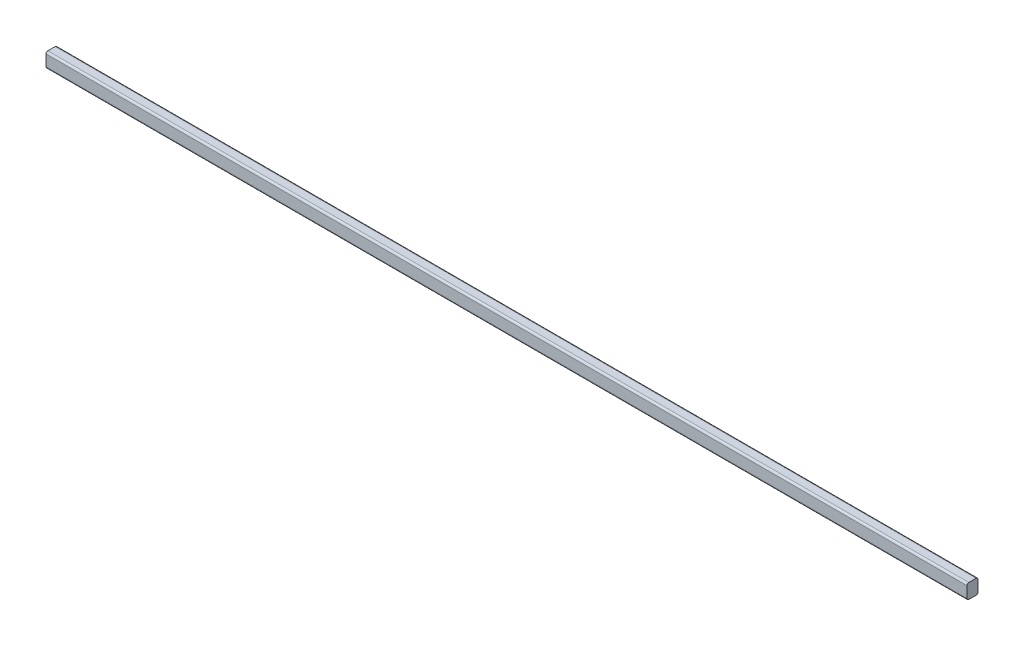
ISO-10303-21;
HEADER;
FILE_DESCRIPTION(('STEP AP214'),'2;1');
FILE_NAME('part.step','',(''),(''),'','','');
FILE_SCHEMA(('AUTOMOTIVE_DESIGN { 1 0 10303 214 1 1 1 1 }'));
ENDSEC;
DATA;
#1=APPLICATION_CONTEXT('core data for automotive mechanical design processes');
#2=APPLICATION_PROTOCOL_DEFINITION('international standard','automotive_design',2000,#1);
#3=PRODUCT_CONTEXT('',#1,'mechanical');
#4=PRODUCT('Part','Part','',(#3));
#5=PRODUCT_RELATED_PRODUCT_CATEGORY('part','',(#4));
#6=PRODUCT_DEFINITION_FORMATION('','',#4);
#7=PRODUCT_DEFINITION_CONTEXT('part definition',#1,'design');
#8=PRODUCT_DEFINITION('design','',#6,#7);
#9=PRODUCT_DEFINITION_SHAPE('','',#8);
#10=(LENGTH_UNIT() NAMED_UNIT(*) SI_UNIT(.MILLI.,.METRE.));
#11=(NAMED_UNIT(*) PLANE_ANGLE_UNIT() SI_UNIT($,.RADIAN.));
#12=(NAMED_UNIT(*) SI_UNIT($,.STERADIAN.) SOLID_ANGLE_UNIT());
#13=UNCERTAINTY_MEASURE_WITH_UNIT(LENGTH_MEASURE(1.E-05),#10,'distance_accuracy_value','');
#14=(GEOMETRIC_REPRESENTATION_CONTEXT(3) GLOBAL_UNCERTAINTY_ASSIGNED_CONTEXT((#13)) GLOBAL_UNIT_ASSIGNED_CONTEXT((#10,
#11,#12)) REPRESENTATION_CONTEXT('',''));
#15=CARTESIAN_POINT('',(0.,0.,0.));
#16=DIRECTION('',(0.,0.,1.));
#17=DIRECTION('',(1.,0.,0.));
#18=AXIS2_PLACEMENT_3D('',#15,#16,#17);
#19=CARTESIAN_POINT('',(613.853261492943,-27.6631184658413,212.));
#20=DIRECTION('',(-1.,0.,0.));
#21=DIRECTION('',(0.,0.,1.));
#22=AXIS2_PLACEMENT_3D('',#19,#20,#21);
#23=CYLINDRICAL_SURFACE('',#22,3.);
#24=DIRECTION('',(-1.,0.,0.));
#25=VECTOR('',#24,1.);
#26=CARTESIAN_POINT('',(613.853261492943,-27.6631184658412,215.));
#27=LINE('',#26,#25);
#28=CARTESIAN_POINT('',(613.853261492943,-27.6631184658412,215.));
#29=VERTEX_POINT('',#28);
#30=CARTESIAN_POINT('',(-886.146738507057,-27.6631184658412,215.));
#31=VERTEX_POINT('',#30);
#32=EDGE_CURVE('E268',#29,#31,#27,.T.);
#33=ORIENTED_EDGE('',*,*,#32,.T.);
#34=CARTESIAN_POINT('',(-886.146738507057,-27.6631184658413,212.));
#35=DIRECTION('',(-1.,0.,0.));
#36=DIRECTION('',(0.,0.,-1.));
#37=AXIS2_PLACEMENT_3D('',#34,#35,#36);
#38=CIRCLE('',#37,3.);
#39=CARTESIAN_POINT('',(-886.146738507057,-30.6631184658413,212.));
#40=VERTEX_POINT('',#39);
#41=EDGE_CURVE('E329',#40,#31,#38,.T.);
#42=ORIENTED_EDGE('',*,*,#41,.F.);
#43=DIRECTION('',(-1.,0.,0.));
#44=VECTOR('',#43,1.);
#45=CARTESIAN_POINT('',(613.853261492943,-30.6631184658413,212.));
#46=LINE('',#45,#44);
#47=CARTESIAN_POINT('',(613.853261492943,-30.6631184658413,212.));
#48=VERTEX_POINT('',#47);
#49=EDGE_CURVE('E13',#48,#40,#46,.T.);
#50=ORIENTED_EDGE('',*,*,#49,.F.);
#51=CARTESIAN_POINT('',(613.853261492943,-27.6631184658413,212.));
#52=DIRECTION('',(-1.,0.,0.));
#53=DIRECTION('',(0.,0.,-1.));
#54=AXIS2_PLACEMENT_3D('',#51,#52,#53);
#55=CIRCLE('',#54,3.);
#56=EDGE_CURVE('E330',#48,#29,#55,.T.);
#57=ORIENTED_EDGE('',*,*,#56,.T.);
#58=EDGE_LOOP('',(#33,#42,#50,#57));
#59=FACE_BOUND('',#58,.T.);
#60=ADVANCED_FACE('F265',(#59),#23,.T.);
#61=CARTESIAN_POINT('',(613.853261492943,-30.6631184658413,212.));
#62=DIRECTION('',(0.,-1.,0.));
#63=DIRECTION('',(0.,0.,-1.));
#64=AXIS2_PLACEMENT_3D('',#61,#62,#63);
#65=PLANE('',#64);
#66=ORIENTED_EDGE('',*,*,#49,.T.);
#67=DIRECTION('',(0.,0.,1.));
#68=VECTOR('',#67,1.);
#69=CARTESIAN_POINT('',(-886.146738507057,-30.6631184658413,212.));
#70=LINE('',#69,#68);
#71=CARTESIAN_POINT('',(-886.146738507057,-30.6631184658413,200.));
#72=VERTEX_POINT('',#71);
#73=EDGE_CURVE('E347',#72,#40,#70,.T.);
#74=ORIENTED_EDGE('',*,*,#73,.F.);
#75=DIRECTION('',(-1.,0.,0.));
#76=VECTOR('',#75,1.);
#77=CARTESIAN_POINT('',(613.853261492943,-30.6631184658413,200.));
#78=LINE('',#77,#76);
#79=CARTESIAN_POINT('',(613.853261492943,-30.6631184658413,200.));
#80=VERTEX_POINT('',#79);
#81=EDGE_CURVE('E273',#80,#72,#78,.T.);
#82=ORIENTED_EDGE('',*,*,#81,.F.);
#83=DIRECTION('',(0.,0.,1.));
#84=VECTOR('',#83,1.);
#85=CARTESIAN_POINT('',(613.853261492943,-30.6631184658413,212.));
#86=LINE('',#85,#84);
#87=EDGE_CURVE('E335',#80,#48,#86,.T.);
#88=ORIENTED_EDGE('',*,*,#87,.T.);
#89=EDGE_LOOP('',(#66,#74,#82,#88));
#90=FACE_BOUND('',#89,.T.);
#91=ADVANCED_FACE('F411',(#90),#65,.T.);
#92=CARTESIAN_POINT('',(613.853261492943,-27.6631184658413,200.));
#93=DIRECTION('',(-1.,0.,0.));
#94=DIRECTION('',(0.,0.,1.));
#95=AXIS2_PLACEMENT_3D('',#92,#93,#94);
#96=CYLINDRICAL_SURFACE('',#95,3.);
#97=ORIENTED_EDGE('',*,*,#81,.T.);
#98=CARTESIAN_POINT('',(-886.146738507057,-27.6631184658413,200.));
#99=DIRECTION('',(-1.,0.,0.));
#100=DIRECTION('',(0.,0.,1.));
#101=AXIS2_PLACEMENT_3D('',#98,#99,#100);
#102=CIRCLE('',#101,3.);
#103=CARTESIAN_POINT('',(-886.146738507057,-27.6631184658412,197.));
#104=VERTEX_POINT('',#103);
#105=EDGE_CURVE('E360',#104,#72,#102,.T.);
#106=ORIENTED_EDGE('',*,*,#105,.F.);
#107=DIRECTION('',(-1.,0.,0.));
#108=VECTOR('',#107,1.);
#109=CARTESIAN_POINT('',(613.853261492943,-27.6631184658412,197.));
#110=LINE('',#109,#108);
#111=CARTESIAN_POINT('',(613.853261492943,-27.6631184658412,197.));
#112=VERTEX_POINT('',#111);
#113=EDGE_CURVE('E382',#112,#104,#110,.T.);
#114=ORIENTED_EDGE('',*,*,#113,.F.);
#115=CARTESIAN_POINT('',(613.853261492943,-27.6631184658413,200.));
#116=DIRECTION('',(-1.,0.,0.));
#117=DIRECTION('',(0.,0.,1.));
#118=AXIS2_PLACEMENT_3D('',#115,#116,#117);
#119=CIRCLE('',#118,3.);
#120=EDGE_CURVE('E378',#112,#80,#119,.T.);
#121=ORIENTED_EDGE('',*,*,#120,.T.);
#122=EDGE_LOOP('',(#97,#106,#114,#121));
#123=FACE_BOUND('',#122,.T.);
#124=ADVANCED_FACE('F410',(#123),#96,.T.);
#125=CARTESIAN_POINT('',(613.853261492943,-27.6631184658412,197.));
#126=DIRECTION('',(0.,0.,-1.));
#127=DIRECTION('',(-1.,0.,0.));
#128=AXIS2_PLACEMENT_3D('',#125,#126,#127);
#129=PLANE('',#128);
#130=ORIENTED_EDGE('',*,*,#113,.T.);
#131=DIRECTION('',(0.,-1.,0.));
#132=VECTOR('',#131,1.);
#133=CARTESIAN_POINT('',(-886.146738507057,-27.6631184658412,197.));
#134=LINE('',#133,#132);
#135=CARTESIAN_POINT('',(-886.146738507057,-9.66311846584128,197.));
#136=VERTEX_POINT('',#135);
#137=EDGE_CURVE('E357',#136,#104,#134,.T.);
#138=ORIENTED_EDGE('',*,*,#137,.F.);
#139=DIRECTION('',(-1.,0.,0.));
#140=VECTOR('',#139,1.);
#141=CARTESIAN_POINT('',(613.853261492943,-9.66311846584128,197.));
#142=LINE('',#141,#140);
#143=CARTESIAN_POINT('',(613.853261492943,-9.66311846584128,197.));
#144=VERTEX_POINT('',#143);
#145=EDGE_CURVE('E384',#144,#136,#142,.T.);
#146=ORIENTED_EDGE('',*,*,#145,.F.);
#147=DIRECTION('',(0.,-1.,0.));
#148=VECTOR('',#147,1.);
#149=CARTESIAN_POINT('',(613.853261492943,-27.6631184658412,197.));
#150=LINE('',#149,#148);
#151=EDGE_CURVE('E375',#144,#112,#150,.T.);
#152=ORIENTED_EDGE('',*,*,#151,.T.);
#153=EDGE_LOOP('',(#130,#138,#146,#152));
#154=FACE_BOUND('',#153,.T.);
#155=ADVANCED_FACE('F406',(#154),#129,.T.);
#156=CARTESIAN_POINT('',(613.853261492943,-9.66311846584125,200.));
#157=DIRECTION('',(-1.,0.,0.));
#158=DIRECTION('',(0.,0.,1.));
#159=AXIS2_PLACEMENT_3D('',#156,#157,#158);
#160=CYLINDRICAL_SURFACE('',#159,3.);
#161=ORIENTED_EDGE('',*,*,#145,.T.);
#162=CARTESIAN_POINT('',(-886.146738507057,-9.66311846584125,200.));
#163=DIRECTION('',(-1.,0.,0.));
#164=DIRECTION('',(0.,0.,1.));
#165=AXIS2_PLACEMENT_3D('',#162,#163,#164);
#166=CIRCLE('',#165,3.);
#167=CARTESIAN_POINT('',(-886.146738507057,-6.66311846584125,200.));
#168=VERTEX_POINT('',#167);
#169=EDGE_CURVE('E354',#168,#136,#166,.T.);
#170=ORIENTED_EDGE('',*,*,#169,.F.);
#171=DIRECTION('',(-1.,0.,0.));
#172=VECTOR('',#171,1.);
#173=CARTESIAN_POINT('',(613.853261492943,-6.66311846584125,200.));
#174=LINE('',#173,#172);
#175=CARTESIAN_POINT('',(613.853261492943,-6.66311846584125,200.));
#176=VERTEX_POINT('',#175);
#177=EDGE_CURVE('E386',#176,#168,#174,.T.);
#178=ORIENTED_EDGE('',*,*,#177,.F.);
#179=CARTESIAN_POINT('',(613.853261492943,-9.66311846584125,200.));
#180=DIRECTION('',(-1.,0.,0.));
#181=DIRECTION('',(0.,0.,1.));
#182=AXIS2_PLACEMENT_3D('',#179,#180,#181);
#183=CIRCLE('',#182,3.);
#184=EDGE_CURVE('E372',#176,#144,#183,.T.);
#185=ORIENTED_EDGE('',*,*,#184,.T.);
#186=EDGE_LOOP('',(#161,#170,#178,#185));
#187=FACE_BOUND('',#186,.T.);
#188=ADVANCED_FACE('F399',(#187),#160,.T.);
#189=CARTESIAN_POINT('',(613.853261492943,-6.66311846584125,200.));
#190=DIRECTION('',(0.,1.,0.));
#191=DIRECTION('',(0.,0.,1.));
#192=AXIS2_PLACEMENT_3D('',#189,#190,#191);
#193=PLANE('',#192);
#194=ORIENTED_EDGE('',*,*,#177,.T.);
#195=DIRECTION('',(0.,0.,-1.));
#196=VECTOR('',#195,1.);
#197=CARTESIAN_POINT('',(-886.146738507057,-6.66311846584125,200.));
#198=LINE('',#197,#196);
#199=CARTESIAN_POINT('',(-886.146738507057,-6.66311846584125,212.));
#200=VERTEX_POINT('',#199);
#201=EDGE_CURVE('E351',#200,#168,#198,.T.);
#202=ORIENTED_EDGE('',*,*,#201,.F.);
#203=DIRECTION('',(-1.,0.,0.));
#204=VECTOR('',#203,1.);
#205=CARTESIAN_POINT('',(613.853261492943,-6.66311846584125,212.));
#206=LINE('',#205,#204);
#207=CARTESIAN_POINT('',(613.853261492943,-6.66311846584125,212.));
#208=VERTEX_POINT('',#207);
#209=EDGE_CURVE('E388',#208,#200,#206,.T.);
#210=ORIENTED_EDGE('',*,*,#209,.F.);
#211=DIRECTION('',(0.,0.,-1.));
#212=VECTOR('',#211,1.);
#213=CARTESIAN_POINT('',(613.853261492943,-6.66311846584125,200.));
#214=LINE('',#213,#212);
#215=EDGE_CURVE('E369',#208,#176,#214,.T.);
#216=ORIENTED_EDGE('',*,*,#215,.T.);
#217=EDGE_LOOP('',(#194,#202,#210,#216));
#218=FACE_BOUND('',#217,.T.);
#219=ADVANCED_FACE('F396',(#218),#193,.T.);
#220=CARTESIAN_POINT('',(613.853261492943,-9.66311846584125,212.));
#221=DIRECTION('',(-1.,0.,0.));
#222=DIRECTION('',(0.,0.,1.));
#223=AXIS2_PLACEMENT_3D('',#220,#221,#222);
#224=CYLINDRICAL_SURFACE('',#223,3.);
#225=ORIENTED_EDGE('',*,*,#209,.T.);
#226=CARTESIAN_POINT('',(-886.146738507057,-9.66311846584125,212.));
#227=DIRECTION('',(-1.,0.,0.));
#228=DIRECTION('',(0.,0.,-1.));
#229=AXIS2_PLACEMENT_3D('',#226,#227,#228);
#230=CIRCLE('',#229,3.);
#231=CARTESIAN_POINT('',(-886.146738507057,-9.66311846584128,215.));
#232=VERTEX_POINT('',#231);
#233=EDGE_CURVE('E342',#232,#200,#230,.T.);
#234=ORIENTED_EDGE('',*,*,#233,.F.);
#235=DIRECTION('',(-1.,0.,0.));
#236=VECTOR('',#235,1.);
#237=CARTESIAN_POINT('',(613.853261492943,-9.66311846584128,215.));
#238=LINE('',#237,#236);
#239=CARTESIAN_POINT('',(613.853261492943,-9.66311846584128,215.));
#240=VERTEX_POINT('',#239);
#241=EDGE_CURVE('E334',#240,#232,#238,.T.);
#242=ORIENTED_EDGE('',*,*,#241,.F.);
#243=CARTESIAN_POINT('',(613.853261492943,-9.66311846584125,212.));
#244=DIRECTION('',(-1.,0.,0.));
#245=DIRECTION('',(0.,0.,-1.));
#246=AXIS2_PLACEMENT_3D('',#243,#244,#245);
#247=CIRCLE('',#246,3.);
#248=EDGE_CURVE('E366',#240,#208,#247,.T.);
#249=ORIENTED_EDGE('',*,*,#248,.T.);
#250=EDGE_LOOP('',(#225,#234,#242,#249));
#251=FACE_BOUND('',#250,.T.);
#252=ADVANCED_FACE('F390',(#251),#224,.T.);
#253=CARTESIAN_POINT('',(613.853261492943,-27.6631184658412,215.));
#254=DIRECTION('',(0.,0.,1.));
#255=DIRECTION('',(1.,0.,0.));
#256=AXIS2_PLACEMENT_3D('',#253,#254,#255);
#257=PLANE('',#256);
#258=ORIENTED_EDGE('',*,*,#241,.T.);
#259=DIRECTION('',(0.,1.,0.));
#260=VECTOR('',#259,1.);
#261=CARTESIAN_POINT('',(-886.146738507057,-27.6631184658412,215.));
#262=LINE('',#261,#260);
#263=EDGE_CURVE('E337',#31,#232,#262,.T.);
#264=ORIENTED_EDGE('',*,*,#263,.F.);
#265=ORIENTED_EDGE('',*,*,#32,.F.);
#266=DIRECTION('',(0.,1.,0.));
#267=VECTOR('',#266,1.);
#268=CARTESIAN_POINT('',(613.853261492943,-27.6631184658412,215.));
#269=LINE('',#268,#267);
#270=EDGE_CURVE('E364',#29,#240,#269,.T.);
#271=ORIENTED_EDGE('',*,*,#270,.T.);
#272=EDGE_LOOP('',(#258,#264,#265,#271));
#273=FACE_BOUND('',#272,.T.);
#274=ADVANCED_FACE('F338',(#273),#257,.T.);
#275=CARTESIAN_POINT('',(613.853261492943,-27.6631184658413,212.));
#276=DIRECTION('',(1.,0.,0.));
#277=DIRECTION('',(0.,0.,-1.));
#278=AXIS2_PLACEMENT_3D('',#275,#276,#277);
#279=PLANE('',#278);
#280=ORIENTED_EDGE('',*,*,#56,.F.);
#281=ORIENTED_EDGE('',*,*,#87,.F.);
#282=ORIENTED_EDGE('',*,*,#120,.F.);
#283=ORIENTED_EDGE('',*,*,#151,.F.);
#284=ORIENTED_EDGE('',*,*,#184,.F.);
#285=ORIENTED_EDGE('',*,*,#215,.F.);
#286=ORIENTED_EDGE('',*,*,#248,.F.);
#287=ORIENTED_EDGE('',*,*,#270,.F.);
#288=EDGE_LOOP('',(#280,#281,#282,#283,#284,#285,#286,#287));
#289=FACE_BOUND('',#288,.T.);
#290=ADVANCED_FACE('F402',(#289),#279,.T.);
#291=CARTESIAN_POINT('',(-886.146738507057,-27.6631184658413,212.));
#292=DIRECTION('',(1.,0.,0.));
#293=DIRECTION('',(0.,0.,-1.));
#294=AXIS2_PLACEMENT_3D('',#291,#292,#293);
#295=PLANE('',#294);
#296=ORIENTED_EDGE('',*,*,#41,.T.);
#297=ORIENTED_EDGE('',*,*,#263,.T.);
#298=ORIENTED_EDGE('',*,*,#233,.T.);
#299=ORIENTED_EDGE('',*,*,#201,.T.);
#300=ORIENTED_EDGE('',*,*,#169,.T.);
#301=ORIENTED_EDGE('',*,*,#137,.T.);
#302=ORIENTED_EDGE('',*,*,#105,.T.);
#303=ORIENTED_EDGE('',*,*,#73,.T.);
#304=EDGE_LOOP('',(#296,#297,#298,#299,#300,#301,#302,#303));
#305=FACE_BOUND('',#304,.T.);
#306=ADVANCED_FACE('F345',(#305),#295,.F.);
#307=CLOSED_SHELL('',(#60,#91,#124,#155,#188,#219,#252,#274,#290,#306));
#308=MANIFOLD_SOLID_BREP('B2',#307);
#309=ADVANCED_BREP_SHAPE_REPRESENTATION('',(#18,#308),#14);
#310=SHAPE_DEFINITION_REPRESENTATION(#9,#309);
ENDSEC;
END-ISO-10303-21;
